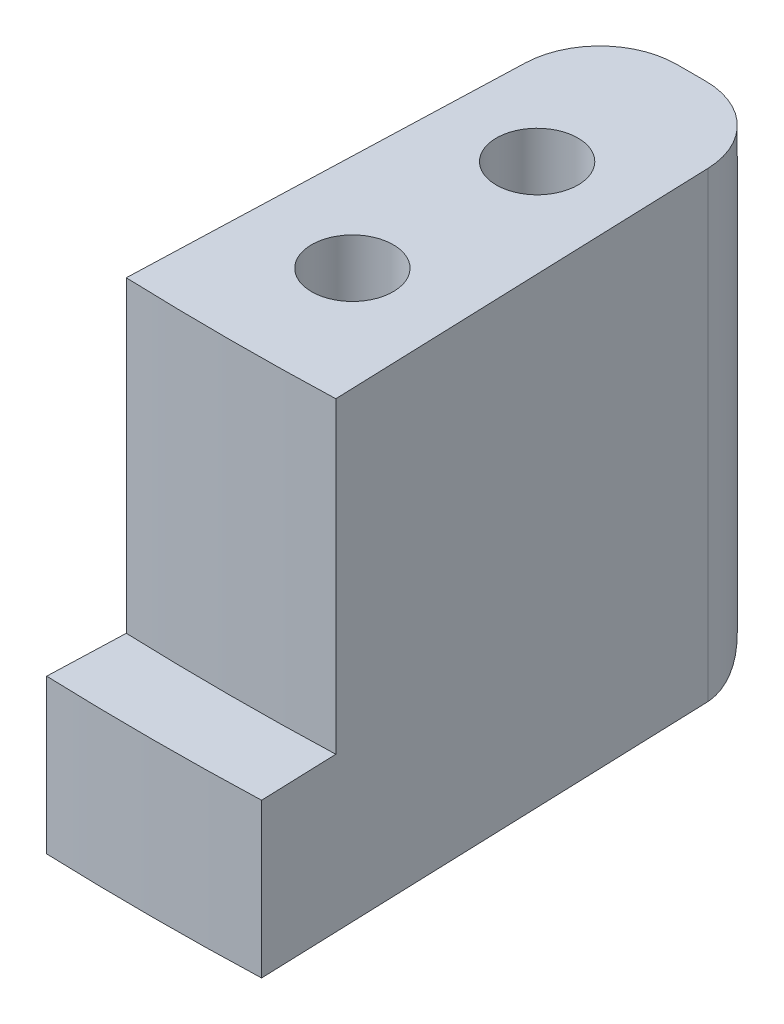
ISO-10303-21;
HEADER;
FILE_DESCRIPTION(('STEP AP214'),'2;1');
FILE_NAME('part.step','',(''),(''),'','','');
FILE_SCHEMA(('AUTOMOTIVE_DESIGN { 1 0 10303 214 1 1 1 1 }'));
ENDSEC;
DATA;
#1=APPLICATION_CONTEXT('core data for automotive mechanical design processes');
#2=APPLICATION_PROTOCOL_DEFINITION('international standard','automotive_design',2000,#1);
#3=PRODUCT_CONTEXT('',#1,'mechanical');
#4=PRODUCT('Part','Part','',(#3));
#5=PRODUCT_RELATED_PRODUCT_CATEGORY('part','',(#4));
#6=PRODUCT_DEFINITION_FORMATION('','',#4);
#7=PRODUCT_DEFINITION_CONTEXT('part definition',#1,'design');
#8=PRODUCT_DEFINITION('design','',#6,#7);
#9=PRODUCT_DEFINITION_SHAPE('','',#8);
#10=(LENGTH_UNIT() NAMED_UNIT(*) SI_UNIT(.MILLI.,.METRE.));
#11=(NAMED_UNIT(*) PLANE_ANGLE_UNIT() SI_UNIT($,.RADIAN.));
#12=(NAMED_UNIT(*) SI_UNIT($,.STERADIAN.) SOLID_ANGLE_UNIT());
#13=UNCERTAINTY_MEASURE_WITH_UNIT(LENGTH_MEASURE(1.E-05),#10,'distance_accuracy_value','');
#14=(GEOMETRIC_REPRESENTATION_CONTEXT(3) GLOBAL_UNCERTAINTY_ASSIGNED_CONTEXT((#13)) GLOBAL_UNIT_ASSIGNED_CONTEXT((#10,
#11,#12)) REPRESENTATION_CONTEXT('',''));
#15=CARTESIAN_POINT('',(0.,0.,0.));
#16=DIRECTION('',(0.,0.,1.));
#17=DIRECTION('',(1.,0.,0.));
#18=AXIS2_PLACEMENT_3D('',#15,#16,#17);
#19=CARTESIAN_POINT('',(0.,30.,175.));
#20=DIRECTION('',(0.,1.,0.));
#21=DIRECTION('',(0.,0.,1.));
#22=AXIS2_PLACEMENT_3D('',#19,#20,#21);
#23=CYLINDRICAL_SURFACE('',#22,2.65);
#24=CARTESIAN_POINT('',(0.,30.,175.));
#25=DIRECTION('',(0.,1.,0.));
#26=DIRECTION('',(0.,0.,1.));
#27=AXIS2_PLACEMENT_3D('',#24,#25,#26);
#28=CIRCLE('',#27,2.65);
#29=CARTESIAN_POINT('',(0.,30.,177.65));
#30=VERTEX_POINT('',#29);
#31=EDGE_CURVE('E283',#30,#30,#28,.T.);
#32=ORIENTED_EDGE('',*,*,#31,.T.);
#33=EDGE_LOOP('',(#32));
#34=FACE_BOUND('',#33,.T.);
#35=CARTESIAN_POINT('',(0.,5.,175.));
#36=DIRECTION('',(0.,-1.,0.));
#37=DIRECTION('',(0.,0.,-1.));
#38=AXIS2_PLACEMENT_3D('',#35,#36,#37);
#39=CIRCLE('',#38,2.65);
#40=CARTESIAN_POINT('',(0.,5.,172.35));
#41=VERTEX_POINT('',#40);
#42=EDGE_CURVE('E38',#41,#41,#39,.F.);
#43=ORIENTED_EDGE('',*,*,#42,.F.);
#44=EDGE_LOOP('',(#43));
#45=FACE_BOUND('',#44,.T.);
#46=ADVANCED_FACE('F34',(#34,#45),#23,.F.);
#47=CARTESIAN_POINT('',(0.,30.,187.));
#48=DIRECTION('',(0.,1.,0.));
#49=DIRECTION('',(0.,0.,1.));
#50=AXIS2_PLACEMENT_3D('',#47,#48,#49);
#51=CYLINDRICAL_SURFACE('',#50,2.65);
#52=CARTESIAN_POINT('',(0.,30.,187.));
#53=DIRECTION('',(0.,1.,0.));
#54=DIRECTION('',(0.,0.,1.));
#55=AXIS2_PLACEMENT_3D('',#52,#53,#54);
#56=CIRCLE('',#55,2.65);
#57=CARTESIAN_POINT('',(0.,30.,189.65));
#58=VERTEX_POINT('',#57);
#59=EDGE_CURVE('E280',#58,#58,#56,.T.);
#60=ORIENTED_EDGE('',*,*,#59,.T.);
#61=EDGE_LOOP('',(#60));
#62=FACE_BOUND('',#61,.T.);
#63=CARTESIAN_POINT('',(0.,5.,187.));
#64=DIRECTION('',(0.,-1.,0.));
#65=DIRECTION('',(0.,0.,-1.));
#66=AXIS2_PLACEMENT_3D('',#63,#64,#65);
#67=CIRCLE('',#66,2.65);
#68=CARTESIAN_POINT('',(0.,5.,184.35));
#69=VERTEX_POINT('',#68);
#70=EDGE_CURVE('E227',#69,#69,#67,.F.);
#71=ORIENTED_EDGE('',*,*,#70,.F.);
#72=EDGE_LOOP('',(#71));
#73=FACE_BOUND('',#72,.T.);
#74=ADVANCED_FACE('F353',(#62,#73),#51,.F.);
#75=CARTESIAN_POINT('',(0.,30.,0.));
#76=DIRECTION('',(0.999390827019096,0.,0.034899496702501));
#77=DIRECTION('',(0.034899496702501,0.,-0.999390827019096));
#78=AXIS2_PLACEMENT_3D('',#75,#76,#77);
#79=PLANE('',#78);
#80=DIRECTION('',(-0.034899496702501,0.,0.999390827019096));
#81=VECTOR('',#80,1.);
#82=CARTESIAN_POINT('',(0.,30.,0.));
#83=LINE('',#82,#81);
#84=CARTESIAN_POINT('',(-5.93043722719849,30.,169.825502516488));
#85=VERTEX_POINT('',#84);
#86=CARTESIAN_POINT('',(-6.80540185698768,30.,194.881211268724));
#87=VERTEX_POINT('',#86);
#88=EDGE_CURVE('E308',#85,#87,#83,.T.);
#89=ORIENTED_EDGE('',*,*,#88,.F.);
#90=DIRECTION('',(0.,-1.,0.));
#91=VECTOR('',#90,1.);
#92=CARTESIAN_POINT('',(-5.93043722719848,0.,169.825502516488));
#93=LINE('',#92,#91);
#94=CARTESIAN_POINT('',(-5.93043722719848,0.00304586490452183,169.825502516488));
#95=VERTEX_POINT('',#94);
#96=EDGE_CURVE('E328',#85,#95,#93,.T.);
#97=ORIENTED_EDGE('',*,*,#96,.T.);
#98=CARTESIAN_POINT('',(-5.93653081359711,5.,170.));
#99=DIRECTION('',(0.999390827019096,0.,0.034899496702501));
#100=DIRECTION('',(-0.034899496702501,0.,0.999390827019096));
#101=AXIS2_PLACEMENT_3D('',#98,#99,#100);
#102=ELLIPSE('',#101,5.00304772149411,5.);
#103=CARTESIAN_POINT('',(-5.93653081359711,0.,170.));
#104=VERTEX_POINT('',#103);
#105=EDGE_CURVE('E326',#95,#104,#102,.F.);
#106=ORIENTED_EDGE('',*,*,#105,.T.);
#107=DIRECTION('',(-0.034899496702501,0.,0.999390827019096));
#108=VECTOR('',#107,1.);
#109=CARTESIAN_POINT('',(0.,0.,0.));
#110=LINE('',#109,#108);
#111=CARTESIAN_POINT('',(-6.97989934050019,0.,199.878165403819));
#112=VERTEX_POINT('',#111);
#113=EDGE_CURVE('E307',#104,#112,#110,.T.);
#114=ORIENTED_EDGE('',*,*,#113,.T.);
#115=DIRECTION('',(0.,-1.,0.));
#116=VECTOR('',#115,1.);
#117=CARTESIAN_POINT('',(-6.97989934050019,10.,199.878165403819));
#118=LINE('',#117,#116);
#119=CARTESIAN_POINT('',(-6.97989934050019,10.,199.878165403819));
#120=VERTEX_POINT('',#119);
#121=EDGE_CURVE('E304',#120,#112,#118,.T.);
#122=ORIENTED_EDGE('',*,*,#121,.F.);
#123=DIRECTION('',(-0.034899496702501,0.,0.999390827019096));
#124=VECTOR('',#123,1.);
#125=CARTESIAN_POINT('',(0.,10.,0.));
#126=LINE('',#125,#124);
#127=CARTESIAN_POINT('',(-6.80540185698768,10.,194.881211268724));
#128=VERTEX_POINT('',#127);
#129=EDGE_CURVE('E287',#128,#120,#126,.T.);
#130=ORIENTED_EDGE('',*,*,#129,.F.);
#131=DIRECTION('',(0.,-1.,0.));
#132=VECTOR('',#131,1.);
#133=CARTESIAN_POINT('',(-6.80540185698768,30.,194.881211268724));
#134=LINE('',#133,#132);
#135=EDGE_CURVE('E324',#87,#128,#134,.T.);
#136=ORIENTED_EDGE('',*,*,#135,.F.);
#137=EDGE_LOOP('',(#89,#97,#106,#114,#122,#130,#136));
#138=FACE_BOUND('',#137,.T.);
#139=ADVANCED_FACE('F360',(#138),#79,.F.);
#140=CARTESIAN_POINT('',(0.,30.,0.));
#141=DIRECTION('',(0.,-1.,0.));
#142=DIRECTION('',(0.,0.,-1.));
#143=AXIS2_PLACEMENT_3D('',#140,#141,#142);
#144=CYLINDRICAL_SURFACE('',#143,195.);
#145=ORIENTED_EDGE('',*,*,#135,.T.);
#146=CARTESIAN_POINT('',(0.,10.,0.));
#147=DIRECTION('',(0.,1.,0.));
#148=DIRECTION('',(0.,0.,1.));
#149=AXIS2_PLACEMENT_3D('',#146,#147,#148);
#150=CIRCLE('',#149,195.);
#151=CARTESIAN_POINT('',(6.80540185698774,10.,194.881211268724));
#152=VERTEX_POINT('',#151);
#153=EDGE_CURVE('E296',#128,#152,#150,.T.);
#154=ORIENTED_EDGE('',*,*,#153,.T.);
#155=DIRECTION('',(0.,-1.,0.));
#156=VECTOR('',#155,1.);
#157=CARTESIAN_POINT('',(6.80540185698774,30.,194.881211268724));
#158=LINE('',#157,#156);
#159=CARTESIAN_POINT('',(6.80540185698774,30.,194.881211268724));
#160=VERTEX_POINT('',#159);
#161=EDGE_CURVE('E319',#160,#152,#158,.T.);
#162=ORIENTED_EDGE('',*,*,#161,.F.);
#163=CARTESIAN_POINT('',(0.,30.,0.));
#164=DIRECTION('',(0.,1.,0.));
#165=DIRECTION('',(0.,0.,1.));
#166=AXIS2_PLACEMENT_3D('',#163,#164,#165);
#167=CIRCLE('',#166,195.);
#168=EDGE_CURVE('E310',#87,#160,#167,.T.);
#169=ORIENTED_EDGE('',*,*,#168,.F.);
#170=EDGE_LOOP('',(#145,#154,#162,#169));
#171=FACE_BOUND('',#170,.T.);
#172=ADVANCED_FACE('F388',(#171),#144,.T.);
#173=CARTESIAN_POINT('',(0.,30.,0.));
#174=DIRECTION('',(0.999390827019096,0.,-0.0348994967025013));
#175=DIRECTION('',(-0.0348994967025013,0.,-0.999390827019096));
#176=AXIS2_PLACEMENT_3D('',#173,#174,#175);
#177=PLANE('',#176);
#178=CARTESIAN_POINT('',(5.93653081359717,5.,170.));
#179=DIRECTION('',(0.999390827019096,0.,-0.0348994967025013));
#180=DIRECTION('',(-0.0348994967025013,0.,-0.999390827019096));
#181=AXIS2_PLACEMENT_3D('',#178,#179,#180);
#182=ELLIPSE('',#181,5.00304772149411,5.);
#183=CARTESIAN_POINT('',(5.93653081359717,0.,170.));
#184=VERTEX_POINT('',#183);
#185=CARTESIAN_POINT('',(5.93043722719854,0.00304586490452313,169.825502516488));
#186=VERTEX_POINT('',#185);
#187=EDGE_CURVE('E341',#184,#186,#182,.T.);
#188=ORIENTED_EDGE('',*,*,#187,.T.);
#189=DIRECTION('',(0.,-1.,0.));
#190=VECTOR('',#189,1.);
#191=CARTESIAN_POINT('',(5.93043722719854,30.,169.825502516488));
#192=LINE('',#191,#190);
#193=CARTESIAN_POINT('',(5.93043722719854,30.,169.825502516488));
#194=VERTEX_POINT('',#193);
#195=EDGE_CURVE('E43',#186,#194,#192,.F.);
#196=ORIENTED_EDGE('',*,*,#195,.T.);
#197=DIRECTION('',(0.0348994967025013,0.,0.999390827019096));
#198=VECTOR('',#197,1.);
#199=CARTESIAN_POINT('',(0.,30.,0.));
#200=LINE('',#199,#198);
#201=EDGE_CURVE('E314',#194,#160,#200,.T.);
#202=ORIENTED_EDGE('',*,*,#201,.T.);
#203=ORIENTED_EDGE('',*,*,#161,.T.);
#204=DIRECTION('',(0.0348994967025013,0.,0.999390827019096));
#205=VECTOR('',#204,1.);
#206=CARTESIAN_POINT('',(0.,10.,0.));
#207=LINE('',#206,#205);
#208=CARTESIAN_POINT('',(6.97989934050026,10.,199.878165403819));
#209=VERTEX_POINT('',#208);
#210=EDGE_CURVE('E293',#152,#209,#207,.T.);
#211=ORIENTED_EDGE('',*,*,#210,.T.);
#212=DIRECTION('',(0.,-1.,0.));
#213=VECTOR('',#212,1.);
#214=CARTESIAN_POINT('',(6.97989934050026,10.,199.878165403819));
#215=LINE('',#214,#213);
#216=CARTESIAN_POINT('',(6.97989934050026,0.,199.878165403819));
#217=VERTEX_POINT('',#216);
#218=EDGE_CURVE('E298',#209,#217,#215,.T.);
#219=ORIENTED_EDGE('',*,*,#218,.T.);
#220=DIRECTION('',(0.0348994967025013,0.,0.999390827019096));
#221=VECTOR('',#220,1.);
#222=CARTESIAN_POINT('',(0.,0.,0.));
#223=LINE('',#222,#221);
#224=EDGE_CURVE('E311',#184,#217,#223,.T.);
#225=ORIENTED_EDGE('',*,*,#224,.F.);
#226=EDGE_LOOP('',(#188,#196,#202,#203,#211,#219,#225));
#227=FACE_BOUND('',#226,.T.);
#228=ADVANCED_FACE('F384',(#227),#177,.T.);
#229=CARTESIAN_POINT('',(0.,30.,165.));
#230=DIRECTION('',(0.,0.,-1.));
#231=DIRECTION('',(-1.,0.,0.));
#232=AXIS2_PLACEMENT_3D('',#229,#230,#231);
#233=PLANE('',#232);
#234=DIRECTION('',(1.,0.,0.));
#235=VECTOR('',#234,1.);
#236=CARTESIAN_POINT('',(-5.76192696613837,5.,165.));
#237=LINE('',#236,#235);
#238=CARTESIAN_POINT('',(0.933483092103059,5.,165.));
#239=VERTEX_POINT('',#238);
#240=CARTESIAN_POINT('',(-0.933483092103004,5.,165.));
#241=VERTEX_POINT('',#240);
#242=EDGE_CURVE('E331',#239,#241,#237,.F.);
#243=ORIENTED_EDGE('',*,*,#242,.T.);
#244=DIRECTION('',(0.,-1.,0.));
#245=VECTOR('',#244,1.);
#246=CARTESIAN_POINT('',(-0.933483092103004,30.,165.));
#247=LINE('',#246,#245);
#248=CARTESIAN_POINT('',(-0.933483092103004,30.,165.));
#249=VERTEX_POINT('',#248);
#250=EDGE_CURVE('E335',#241,#249,#247,.F.);
#251=ORIENTED_EDGE('',*,*,#250,.T.);
#252=DIRECTION('',(1.,0.,0.));
#253=VECTOR('',#252,1.);
#254=CARTESIAN_POINT('',(0.,30.,165.));
#255=LINE('',#254,#253);
#256=CARTESIAN_POINT('',(0.933483092103059,30.,165.));
#257=VERTEX_POINT('',#256);
#258=EDGE_CURVE('E316',#249,#257,#255,.T.);
#259=ORIENTED_EDGE('',*,*,#258,.T.);
#260=DIRECTION('',(0.,-1.,0.));
#261=VECTOR('',#260,1.);
#262=CARTESIAN_POINT('',(0.933483092103059,30.,165.));
#263=LINE('',#262,#261);
#264=EDGE_CURVE('E333',#257,#239,#263,.T.);
#265=ORIENTED_EDGE('',*,*,#264,.T.);
#266=EDGE_LOOP('',(#243,#251,#259,#265));
#267=FACE_BOUND('',#266,.T.);
#268=ADVANCED_FACE('F377',(#267),#233,.T.);
#269=CARTESIAN_POINT('',(0.,30.,0.));
#270=DIRECTION('',(0.,1.,0.));
#271=DIRECTION('',(0.,0.,1.));
#272=AXIS2_PLACEMENT_3D('',#269,#270,#271);
#273=PLANE('',#272);
#274=ORIENTED_EDGE('',*,*,#59,.F.);
#275=EDGE_LOOP('',(#274));
#276=FACE_BOUND('',#275,.T.);
#277=ORIENTED_EDGE('',*,*,#31,.F.);
#278=EDGE_LOOP('',(#277));
#279=FACE_BOUND('',#278,.T.);
#280=ORIENTED_EDGE('',*,*,#258,.F.);
#281=CARTESIAN_POINT('',(-0.933483092103004,30.,170.));
#282=DIRECTION('',(0.,1.,0.));
#283=DIRECTION('',(0.,0.,1.));
#284=AXIS2_PLACEMENT_3D('',#281,#282,#283);
#285=CIRCLE('',#284,5.);
#286=EDGE_CURVE('E339',#249,#85,#285,.T.);
#287=ORIENTED_EDGE('',*,*,#286,.T.);
#288=ORIENTED_EDGE('',*,*,#88,.T.);
#289=ORIENTED_EDGE('',*,*,#168,.T.);
#290=ORIENTED_EDGE('',*,*,#201,.F.);
#291=CARTESIAN_POINT('',(0.933483092103059,30.,170.));
#292=DIRECTION('',(0.,1.,0.));
#293=DIRECTION('',(0.,0.,1.));
#294=AXIS2_PLACEMENT_3D('',#291,#292,#293);
#295=CIRCLE('',#294,5.);
#296=EDGE_CURVE('E337',#194,#257,#295,.T.);
#297=ORIENTED_EDGE('',*,*,#296,.T.);
#298=EDGE_LOOP('',(#280,#287,#288,#289,#290,#297));
#299=FACE_BOUND('',#298,.T.);
#300=ADVANCED_FACE('F374',(#276,#279,#299),#273,.T.);
#301=CARTESIAN_POINT('',(0.,0.,0.));
#302=DIRECTION('',(0.,1.,0.));
#303=DIRECTION('',(0.,0.,1.));
#304=AXIS2_PLACEMENT_3D('',#301,#302,#303);
#305=PLANE('',#304);
#306=DIRECTION('',(0.5,0.,-0.866025403784439));
#307=VECTOR('',#306,1.);
#308=CARTESIAN_POINT('',(-4.67653718043598,0.,175.));
#309=LINE('',#308,#307);
#310=CARTESIAN_POINT('',(-4.67653718043598,0.,175.));
#311=VERTEX_POINT('',#310);
#312=CARTESIAN_POINT('',(-2.33826859021798,0.,170.95));
#313=VERTEX_POINT('',#312);
#314=EDGE_CURVE('E214',#311,#313,#309,.T.);
#315=ORIENTED_EDGE('',*,*,#314,.F.);
#316=DIRECTION('',(-0.5,0.,-0.866025403784439));
#317=VECTOR('',#316,1.);
#318=CARTESIAN_POINT('',(-2.33826859021799,0.,179.05));
#319=LINE('',#318,#317);
#320=CARTESIAN_POINT('',(-2.33826859021799,0.,179.05));
#321=VERTEX_POINT('',#320);
#322=EDGE_CURVE('E51',#321,#311,#319,.T.);
#323=ORIENTED_EDGE('',*,*,#322,.F.);
#324=DIRECTION('',(-1.,0.,0.));
#325=VECTOR('',#324,1.);
#326=CARTESIAN_POINT('',(2.33826859021798,0.,179.05));
#327=LINE('',#326,#325);
#328=CARTESIAN_POINT('',(2.33826859021798,0.,179.05));
#329=VERTEX_POINT('',#328);
#330=EDGE_CURVE('E200',#329,#321,#327,.T.);
#331=ORIENTED_EDGE('',*,*,#330,.F.);
#332=DIRECTION('',(-0.500000000000001,0.,0.866025403784438));
#333=VECTOR('',#332,1.);
#334=CARTESIAN_POINT('',(4.67653718043597,0.,175.));
#335=LINE('',#334,#333);
#336=CARTESIAN_POINT('',(4.67653718043597,0.,175.));
#337=VERTEX_POINT('',#336);
#338=EDGE_CURVE('E203',#337,#329,#335,.T.);
#339=ORIENTED_EDGE('',*,*,#338,.F.);
#340=DIRECTION('',(0.499999999999999,0.,0.866025403784439));
#341=VECTOR('',#340,1.);
#342=CARTESIAN_POINT('',(2.33826859021798,0.,170.95));
#343=LINE('',#342,#341);
#344=CARTESIAN_POINT('',(2.33826859021798,0.,170.95));
#345=VERTEX_POINT('',#344);
#346=EDGE_CURVE('E220',#345,#337,#343,.T.);
#347=ORIENTED_EDGE('',*,*,#346,.F.);
#348=DIRECTION('',(1.,0.,0.));
#349=VECTOR('',#348,1.);
#350=CARTESIAN_POINT('',(-2.33826859021798,0.,170.95));
#351=LINE('',#350,#349);
#352=EDGE_CURVE('E217',#313,#345,#351,.T.);
#353=ORIENTED_EDGE('',*,*,#352,.F.);
#354=EDGE_LOOP('',(#315,#323,#331,#339,#347,#353));
#355=FACE_BOUND('',#354,.T.);
#356=DIRECTION('',(0.5,0.,-0.866025403784438));
#357=VECTOR('',#356,1.);
#358=CARTESIAN_POINT('',(-4.67653718043598,0.,187.));
#359=LINE('',#358,#357);
#360=CARTESIAN_POINT('',(-4.67653718043597,0.,187.));
#361=VERTEX_POINT('',#360);
#362=CARTESIAN_POINT('',(-2.33826859021798,0.,182.95));
#363=VERTEX_POINT('',#362);
#364=EDGE_CURVE('E256',#361,#363,#359,.T.);
#365=ORIENTED_EDGE('',*,*,#364,.F.);
#366=DIRECTION('',(-0.5,0.,-0.866025403784439));
#367=VECTOR('',#366,1.);
#368=CARTESIAN_POINT('',(-2.33826859021798,0.,191.05));
#369=LINE('',#368,#367);
#370=CARTESIAN_POINT('',(-2.33826859021798,0.,191.05));
#371=VERTEX_POINT('',#370);
#372=EDGE_CURVE('E59',#371,#361,#369,.T.);
#373=ORIENTED_EDGE('',*,*,#372,.F.);
#374=DIRECTION('',(-1.,0.,0.));
#375=VECTOR('',#374,1.);
#376=CARTESIAN_POINT('',(2.33826859021795,0.,191.05));
#377=LINE('',#376,#375);
#378=CARTESIAN_POINT('',(2.33826859021795,0.,191.05));
#379=VERTEX_POINT('',#378);
#380=EDGE_CURVE('E239',#379,#371,#377,.T.);
#381=ORIENTED_EDGE('',*,*,#380,.F.);
#382=DIRECTION('',(-0.499999999999999,0.,0.866025403784439));
#383=VECTOR('',#382,1.);
#384=CARTESIAN_POINT('',(4.67653718043596,0.,187.));
#385=LINE('',#384,#383);
#386=CARTESIAN_POINT('',(4.67653718043596,0.,187.));
#387=VERTEX_POINT('',#386);
#388=EDGE_CURVE('E265',#387,#379,#385,.T.);
#389=ORIENTED_EDGE('',*,*,#388,.F.);
#390=DIRECTION('',(0.5,0.,0.866025403784438));
#391=VECTOR('',#390,1.);
#392=CARTESIAN_POINT('',(2.33826859021798,0.,182.95));
#393=LINE('',#392,#391);
#394=CARTESIAN_POINT('',(2.33826859021798,0.,182.95));
#395=VERTEX_POINT('',#394);
#396=EDGE_CURVE('E262',#395,#387,#393,.T.);
#397=ORIENTED_EDGE('',*,*,#396,.F.);
#398=DIRECTION('',(1.,0.,0.));
#399=VECTOR('',#398,1.);
#400=CARTESIAN_POINT('',(-2.33826859021798,0.,182.95));
#401=LINE('',#400,#399);
#402=EDGE_CURVE('E259',#363,#395,#401,.T.);
#403=ORIENTED_EDGE('',*,*,#402,.F.);
#404=EDGE_LOOP('',(#365,#373,#381,#389,#397,#403));
#405=FACE_BOUND('',#404,.T.);
#406=ORIENTED_EDGE('',*,*,#113,.F.);
#407=DIRECTION('',(1.,0.,0.));
#408=VECTOR('',#407,1.);
#409=CARTESIAN_POINT('',(5.76192696613841,0.,170.));
#410=LINE('',#409,#408);
#411=EDGE_CURVE('E11',#104,#184,#410,.T.);
#412=ORIENTED_EDGE('',*,*,#411,.T.);
#413=ORIENTED_EDGE('',*,*,#224,.T.);
#414=CARTESIAN_POINT('',(0.,0.,0.));
#415=DIRECTION('',(0.,1.,0.));
#416=DIRECTION('',(0.,0.,1.));
#417=AXIS2_PLACEMENT_3D('',#414,#415,#416);
#418=CIRCLE('',#417,200.);
#419=EDGE_CURVE('E291',#112,#217,#418,.T.);
#420=ORIENTED_EDGE('',*,*,#419,.F.);
#421=EDGE_LOOP('',(#406,#412,#413,#420));
#422=FACE_BOUND('',#421,.T.);
#423=ADVANCED_FACE('F372',(#355,#405,#422),#305,.F.);
#424=CARTESIAN_POINT('',(0.,10.,0.));
#425=DIRECTION('',(0.,-1.,0.));
#426=DIRECTION('',(0.,0.,-1.));
#427=AXIS2_PLACEMENT_3D('',#424,#425,#426);
#428=CYLINDRICAL_SURFACE('',#427,200.);
#429=ORIENTED_EDGE('',*,*,#419,.T.);
#430=ORIENTED_EDGE('',*,*,#218,.F.);
#431=CARTESIAN_POINT('',(0.,10.,0.));
#432=DIRECTION('',(0.,1.,0.));
#433=DIRECTION('',(0.,0.,1.));
#434=AXIS2_PLACEMENT_3D('',#431,#432,#433);
#435=CIRCLE('',#434,200.);
#436=EDGE_CURVE('E290',#120,#209,#435,.T.);
#437=ORIENTED_EDGE('',*,*,#436,.F.);
#438=ORIENTED_EDGE('',*,*,#121,.T.);
#439=EDGE_LOOP('',(#429,#430,#437,#438));
#440=FACE_BOUND('',#439,.T.);
#441=ADVANCED_FACE('F368',(#440),#428,.T.);
#442=CARTESIAN_POINT('',(0.,10.,0.));
#443=DIRECTION('',(0.,1.,0.));
#444=DIRECTION('',(0.,0.,1.));
#445=AXIS2_PLACEMENT_3D('',#442,#443,#444);
#446=PLANE('',#445);
#447=ORIENTED_EDGE('',*,*,#129,.T.);
#448=ORIENTED_EDGE('',*,*,#436,.T.);
#449=ORIENTED_EDGE('',*,*,#210,.F.);
#450=ORIENTED_EDGE('',*,*,#153,.F.);
#451=EDGE_LOOP('',(#447,#448,#449,#450));
#452=FACE_BOUND('',#451,.T.);
#453=ADVANCED_FACE('F365',(#452),#446,.T.);
#454=CARTESIAN_POINT('',(0.933483092103059,30.,170.));
#455=DIRECTION('',(0.,-1.,0.));
#456=DIRECTION('',(0.,0.,-1.));
#457=AXIS2_PLACEMENT_3D('',#454,#455,#456);
#458=CYLINDRICAL_SURFACE('',#457,5.);
#459=ORIENTED_EDGE('',*,*,#296,.F.);
#460=ORIENTED_EDGE('',*,*,#195,.F.);
#461=CARTESIAN_POINT('',(0.933483092103059,5.,170.));
#462=DIRECTION('',(-0.707106781186547,-0.707106781186547,0.));
#463=DIRECTION('',(-0.707106781186547,0.707106781186547,0.));
#464=AXIS2_PLACEMENT_3D('',#461,#462,#463);
#465=ELLIPSE('',#464,7.07106781186547,5.);
#466=EDGE_CURVE('E301',#239,#186,#465,.T.);
#467=ORIENTED_EDGE('',*,*,#466,.F.);
#468=ORIENTED_EDGE('',*,*,#264,.F.);
#469=EDGE_LOOP('',(#459,#460,#467,#468));
#470=FACE_BOUND('',#469,.T.);
#471=ADVANCED_FACE('F36',(#470),#458,.T.);
#472=CARTESIAN_POINT('',(0.,5.,170.));
#473=DIRECTION('',(-1.,0.,0.));
#474=DIRECTION('',(0.,0.,1.));
#475=AXIS2_PLACEMENT_3D('',#472,#473,#474);
#476=CYLINDRICAL_SURFACE('',#475,5.);
#477=ORIENTED_EDGE('',*,*,#411,.F.);
#478=ORIENTED_EDGE('',*,*,#105,.F.);
#479=CARTESIAN_POINT('',(-0.933483092103004,5.,170.));
#480=DIRECTION('',(-0.707106781186547,0.707106781186547,0.));
#481=DIRECTION('',(-0.707106781186547,-0.707106781186547,0.));
#482=AXIS2_PLACEMENT_3D('',#479,#480,#481);
#483=ELLIPSE('',#482,7.07106781186547,5.);
#484=EDGE_CURVE('E286',#241,#95,#483,.T.);
#485=ORIENTED_EDGE('',*,*,#484,.F.);
#486=ORIENTED_EDGE('',*,*,#242,.F.);
#487=ORIENTED_EDGE('',*,*,#466,.T.);
#488=ORIENTED_EDGE('',*,*,#187,.F.);
#489=EDGE_LOOP('',(#477,#478,#485,#486,#487,#488));
#490=FACE_BOUND('',#489,.T.);
#491=ADVANCED_FACE('F399',(#490),#476,.T.);
#492=CARTESIAN_POINT('',(-0.933483092103004,30.,170.));
#493=DIRECTION('',(0.,1.,0.));
#494=DIRECTION('',(0.,0.,1.));
#495=AXIS2_PLACEMENT_3D('',#492,#493,#494);
#496=CYLINDRICAL_SURFACE('',#495,5.);
#497=ORIENTED_EDGE('',*,*,#286,.F.);
#498=ORIENTED_EDGE('',*,*,#250,.F.);
#499=ORIENTED_EDGE('',*,*,#484,.T.);
#500=ORIENTED_EDGE('',*,*,#96,.F.);
#501=EDGE_LOOP('',(#497,#498,#499,#500));
#502=FACE_BOUND('',#501,.T.);
#503=ADVANCED_FACE('F396',(#502),#496,.T.);
#504=CARTESIAN_POINT('',(0.,5.,0.));
#505=DIRECTION('',(0.,-1.,0.));
#506=DIRECTION('',(0.,0.,-1.));
#507=AXIS2_PLACEMENT_3D('',#504,#505,#506);
#508=PLANE('',#507);
#509=DIRECTION('',(-0.5,0.,-0.866025403784439));
#510=VECTOR('',#509,1.);
#511=CARTESIAN_POINT('',(-2.33826859021798,5.,191.05));
#512=LINE('',#511,#510);
#513=CARTESIAN_POINT('',(-2.33826859021798,5.,191.05));
#514=VERTEX_POINT('',#513);
#515=CARTESIAN_POINT('',(-4.67653718043598,5.,187.));
#516=VERTEX_POINT('',#515);
#517=EDGE_CURVE('E235',#514,#516,#512,.T.);
#518=ORIENTED_EDGE('',*,*,#517,.T.);
#519=DIRECTION('',(0.5,0.,-0.866025403784438));
#520=VECTOR('',#519,1.);
#521=CARTESIAN_POINT('',(-4.67653718043598,5.,187.));
#522=LINE('',#521,#520);
#523=CARTESIAN_POINT('',(-2.33826859021798,5.,182.95));
#524=VERTEX_POINT('',#523);
#525=EDGE_CURVE('E238',#516,#524,#522,.T.);
#526=ORIENTED_EDGE('',*,*,#525,.T.);
#527=DIRECTION('',(1.,0.,0.));
#528=VECTOR('',#527,1.);
#529=CARTESIAN_POINT('',(-2.33826859021798,5.,182.95));
#530=LINE('',#529,#528);
#531=CARTESIAN_POINT('',(2.33826859021798,5.,182.95));
#532=VERTEX_POINT('',#531);
#533=EDGE_CURVE('E242',#524,#532,#530,.T.);
#534=ORIENTED_EDGE('',*,*,#533,.T.);
#535=DIRECTION('',(0.5,0.,0.866025403784438));
#536=VECTOR('',#535,1.);
#537=CARTESIAN_POINT('',(2.33826859021798,5.,182.95));
#538=LINE('',#537,#536);
#539=CARTESIAN_POINT('',(4.67653718043596,5.,187.));
#540=VERTEX_POINT('',#539);
#541=EDGE_CURVE('E245',#532,#540,#538,.T.);
#542=ORIENTED_EDGE('',*,*,#541,.T.);
#543=DIRECTION('',(-0.499999999999999,0.,0.866025403784439));
#544=VECTOR('',#543,1.);
#545=CARTESIAN_POINT('',(4.67653718043596,5.,187.));
#546=LINE('',#545,#544);
#547=CARTESIAN_POINT('',(2.33826859021795,5.,191.05));
#548=VERTEX_POINT('',#547);
#549=EDGE_CURVE('E248',#540,#548,#546,.T.);
#550=ORIENTED_EDGE('',*,*,#549,.T.);
#551=DIRECTION('',(-1.,0.,0.));
#552=VECTOR('',#551,1.);
#553=CARTESIAN_POINT('',(2.33826859021795,5.,191.05));
#554=LINE('',#553,#552);
#555=EDGE_CURVE('E251',#548,#514,#554,.T.);
#556=ORIENTED_EDGE('',*,*,#555,.T.);
#557=EDGE_LOOP('',(#518,#526,#534,#542,#550,#556));
#558=FACE_BOUND('',#557,.T.);
#559=ORIENTED_EDGE('',*,*,#70,.T.);
#560=EDGE_LOOP('',(#559));
#561=FACE_BOUND('',#560,.T.);
#562=ADVANCED_FACE('F398',(#558,#561),#508,.T.);
#563=CARTESIAN_POINT('',(-2.33826859021798,5.,191.05));
#564=DIRECTION('',(-0.866025403784439,0.,0.5));
#565=DIRECTION('',(0.5,0.,0.866025403784439));
#566=AXIS2_PLACEMENT_3D('',#563,#564,#565);
#567=PLANE('',#566);
#568=ORIENTED_EDGE('',*,*,#372,.T.);
#569=DIRECTION('',(0.,-1.,0.));
#570=VECTOR('',#569,1.);
#571=CARTESIAN_POINT('',(-4.67653718043598,5.,187.));
#572=LINE('',#571,#570);
#573=EDGE_CURVE('E254',#516,#361,#572,.T.);
#574=ORIENTED_EDGE('',*,*,#573,.F.);
#575=ORIENTED_EDGE('',*,*,#517,.F.);
#576=DIRECTION('',(0.,-1.,0.));
#577=VECTOR('',#576,1.);
#578=CARTESIAN_POINT('',(-2.33826859021798,5.,191.05));
#579=LINE('',#578,#577);
#580=EDGE_CURVE('E215',#514,#371,#579,.T.);
#581=ORIENTED_EDGE('',*,*,#580,.T.);
#582=EDGE_LOOP('',(#568,#574,#575,#581));
#583=FACE_BOUND('',#582,.T.);
#584=ADVANCED_FACE('F521',(#583),#567,.F.);
#585=CARTESIAN_POINT('',(2.33826859021795,5.,191.05));
#586=DIRECTION('',(0.,0.,1.));
#587=DIRECTION('',(1.,0.,0.));
#588=AXIS2_PLACEMENT_3D('',#585,#586,#587);
#589=PLANE('',#588);
#590=ORIENTED_EDGE('',*,*,#380,.T.);
#591=ORIENTED_EDGE('',*,*,#580,.F.);
#592=ORIENTED_EDGE('',*,*,#555,.F.);
#593=DIRECTION('',(0.,-1.,0.));
#594=VECTOR('',#593,1.);
#595=CARTESIAN_POINT('',(2.33826859021795,5.,191.05));
#596=LINE('',#595,#594);
#597=EDGE_CURVE('E271',#548,#379,#596,.T.);
#598=ORIENTED_EDGE('',*,*,#597,.T.);
#599=EDGE_LOOP('',(#590,#591,#592,#598));
#600=FACE_BOUND('',#599,.T.);
#601=ADVANCED_FACE('F528',(#600),#589,.F.);
#602=CARTESIAN_POINT('',(4.67653718043596,5.,187.));
#603=DIRECTION('',(0.866025403784439,0.,0.499999999999999));
#604=DIRECTION('',(0.499999999999999,0.,-0.866025403784439));
#605=AXIS2_PLACEMENT_3D('',#602,#603,#604);
#606=PLANE('',#605);
#607=ORIENTED_EDGE('',*,*,#388,.T.);
#608=ORIENTED_EDGE('',*,*,#597,.F.);
#609=ORIENTED_EDGE('',*,*,#549,.F.);
#610=DIRECTION('',(0.,-1.,0.));
#611=VECTOR('',#610,1.);
#612=CARTESIAN_POINT('',(4.67653718043596,5.,187.));
#613=LINE('',#612,#611);
#614=EDGE_CURVE('E273',#540,#387,#613,.T.);
#615=ORIENTED_EDGE('',*,*,#614,.T.);
#616=EDGE_LOOP('',(#607,#608,#609,#615));
#617=FACE_BOUND('',#616,.T.);
#618=ADVANCED_FACE('F534',(#617),#606,.F.);
#619=CARTESIAN_POINT('',(2.33826859021798,5.,182.95));
#620=DIRECTION('',(0.866025403784438,0.,-0.5));
#621=DIRECTION('',(-0.5,0.,-0.866025403784438));
#622=AXIS2_PLACEMENT_3D('',#619,#620,#621);
#623=PLANE('',#622);
#624=ORIENTED_EDGE('',*,*,#396,.T.);
#625=ORIENTED_EDGE('',*,*,#614,.F.);
#626=ORIENTED_EDGE('',*,*,#541,.F.);
#627=DIRECTION('',(0.,-1.,0.));
#628=VECTOR('',#627,1.);
#629=CARTESIAN_POINT('',(2.33826859021798,5.,182.95));
#630=LINE('',#629,#628);
#631=EDGE_CURVE('E275',#532,#395,#630,.T.);
#632=ORIENTED_EDGE('',*,*,#631,.T.);
#633=EDGE_LOOP('',(#624,#625,#626,#632));
#634=FACE_BOUND('',#633,.T.);
#635=ADVANCED_FACE('F542',(#634),#623,.F.);
#636=CARTESIAN_POINT('',(-2.33826859021798,5.,182.95));
#637=DIRECTION('',(0.,0.,-1.));
#638=DIRECTION('',(-1.,0.,0.));
#639=AXIS2_PLACEMENT_3D('',#636,#637,#638);
#640=PLANE('',#639);
#641=ORIENTED_EDGE('',*,*,#402,.T.);
#642=ORIENTED_EDGE('',*,*,#631,.F.);
#643=ORIENTED_EDGE('',*,*,#533,.F.);
#644=DIRECTION('',(0.,-1.,0.));
#645=VECTOR('',#644,1.);
#646=CARTESIAN_POINT('',(-2.33826859021798,5.,182.95));
#647=LINE('',#646,#645);
#648=EDGE_CURVE('E277',#524,#363,#647,.T.);
#649=ORIENTED_EDGE('',*,*,#648,.T.);
#650=EDGE_LOOP('',(#641,#642,#643,#649));
#651=FACE_BOUND('',#650,.T.);
#652=ADVANCED_FACE('F550',(#651),#640,.F.);
#653=CARTESIAN_POINT('',(-4.67653718043598,5.,187.));
#654=DIRECTION('',(-0.866025403784438,0.,-0.5));
#655=DIRECTION('',(-0.5,0.,0.866025403784439));
#656=AXIS2_PLACEMENT_3D('',#653,#654,#655);
#657=PLANE('',#656);
#658=ORIENTED_EDGE('',*,*,#364,.T.);
#659=ORIENTED_EDGE('',*,*,#648,.F.);
#660=ORIENTED_EDGE('',*,*,#525,.F.);
#661=ORIENTED_EDGE('',*,*,#573,.T.);
#662=EDGE_LOOP('',(#658,#659,#660,#661));
#663=FACE_BOUND('',#662,.T.);
#664=ADVANCED_FACE('F558',(#663),#657,.F.);
#665=CARTESIAN_POINT('',(0.,5.,0.));
#666=DIRECTION('',(0.,-1.,0.));
#667=DIRECTION('',(0.,0.,-1.));
#668=AXIS2_PLACEMENT_3D('',#665,#666,#667);
#669=PLANE('',#668);
#670=DIRECTION('',(-0.5,0.,-0.866025403784439));
#671=VECTOR('',#670,1.);
#672=CARTESIAN_POINT('',(-2.33826859021799,5.,179.05));
#673=LINE('',#672,#671);
#674=CARTESIAN_POINT('',(-2.33826859021799,5.,179.05));
#675=VERTEX_POINT('',#674);
#676=CARTESIAN_POINT('',(-4.67653718043598,5.,175.));
#677=VERTEX_POINT('',#676);
#678=EDGE_CURVE('E180',#675,#677,#673,.T.);
#679=ORIENTED_EDGE('',*,*,#678,.T.);
#680=DIRECTION('',(0.5,0.,-0.866025403784439));
#681=VECTOR('',#680,1.);
#682=CARTESIAN_POINT('',(-4.67653718043598,5.,175.));
#683=LINE('',#682,#681);
#684=CARTESIAN_POINT('',(-2.33826859021798,5.,170.95));
#685=VERTEX_POINT('',#684);
#686=EDGE_CURVE('E189',#677,#685,#683,.T.);
#687=ORIENTED_EDGE('',*,*,#686,.T.);
#688=DIRECTION('',(1.,0.,0.));
#689=VECTOR('',#688,1.);
#690=CARTESIAN_POINT('',(-2.33826859021798,5.,170.95));
#691=LINE('',#690,#689);
#692=CARTESIAN_POINT('',(2.33826859021798,5.,170.95));
#693=VERTEX_POINT('',#692);
#694=EDGE_CURVE('E194',#685,#693,#691,.T.);
#695=ORIENTED_EDGE('',*,*,#694,.T.);
#696=DIRECTION('',(0.499999999999999,0.,0.866025403784439));
#697=VECTOR('',#696,1.);
#698=CARTESIAN_POINT('',(2.33826859021798,5.,170.95));
#699=LINE('',#698,#697);
#700=CARTESIAN_POINT('',(4.67653718043597,5.,175.));
#701=VERTEX_POINT('',#700);
#702=EDGE_CURVE('E207',#693,#701,#699,.T.);
#703=ORIENTED_EDGE('',*,*,#702,.T.);
#704=DIRECTION('',(-0.500000000000001,0.,0.866025403784438));
#705=VECTOR('',#704,1.);
#706=CARTESIAN_POINT('',(4.67653718043597,5.,175.));
#707=LINE('',#706,#705);
#708=CARTESIAN_POINT('',(2.33826859021798,5.,179.05));
#709=VERTEX_POINT('',#708);
#710=EDGE_CURVE('E210',#701,#709,#707,.T.);
#711=ORIENTED_EDGE('',*,*,#710,.T.);
#712=DIRECTION('',(-1.,0.,0.));
#713=VECTOR('',#712,1.);
#714=CARTESIAN_POINT('',(2.33826859021798,5.,179.05));
#715=LINE('',#714,#713);
#716=EDGE_CURVE('E186',#709,#675,#715,.T.);
#717=ORIENTED_EDGE('',*,*,#716,.T.);
#718=EDGE_LOOP('',(#679,#687,#695,#703,#711,#717));
#719=FACE_BOUND('',#718,.T.);
#720=ORIENTED_EDGE('',*,*,#42,.T.);
#721=EDGE_LOOP('',(#720));
#722=FACE_BOUND('',#721,.T.);
#723=ADVANCED_FACE('F196',(#719,#722),#669,.T.);
#724=CARTESIAN_POINT('',(-2.33826859021799,5.,179.05));
#725=DIRECTION('',(-0.866025403784439,0.,0.5));
#726=DIRECTION('',(0.5,0.,0.866025403784439));
#727=AXIS2_PLACEMENT_3D('',#724,#725,#726);
#728=PLANE('',#727);
#729=ORIENTED_EDGE('',*,*,#322,.T.);
#730=DIRECTION('',(0.,-1.,0.));
#731=VECTOR('',#730,1.);
#732=CARTESIAN_POINT('',(-4.67653718043598,5.,175.));
#733=LINE('',#732,#731);
#734=EDGE_CURVE('E176',#677,#311,#733,.T.);
#735=ORIENTED_EDGE('',*,*,#734,.F.);
#736=ORIENTED_EDGE('',*,*,#678,.F.);
#737=DIRECTION('',(0.,-1.,0.));
#738=VECTOR('',#737,1.);
#739=CARTESIAN_POINT('',(-2.33826859021799,5.,179.05));
#740=LINE('',#739,#738);
#741=EDGE_CURVE('E225',#675,#321,#740,.T.);
#742=ORIENTED_EDGE('',*,*,#741,.T.);
#743=EDGE_LOOP('',(#729,#735,#736,#742));
#744=FACE_BOUND('',#743,.T.);
#745=ADVANCED_FACE('F178',(#744),#728,.F.);
#746=CARTESIAN_POINT('',(2.33826859021798,5.,179.05));
#747=DIRECTION('',(0.,0.,1.));
#748=DIRECTION('',(1.,0.,0.));
#749=AXIS2_PLACEMENT_3D('',#746,#747,#748);
#750=PLANE('',#749);
#751=ORIENTED_EDGE('',*,*,#330,.T.);
#752=ORIENTED_EDGE('',*,*,#741,.F.);
#753=ORIENTED_EDGE('',*,*,#716,.F.);
#754=DIRECTION('',(0.,-1.,0.));
#755=VECTOR('',#754,1.);
#756=CARTESIAN_POINT('',(2.33826859021798,5.,179.05));
#757=LINE('',#756,#755);
#758=EDGE_CURVE('E228',#709,#329,#757,.T.);
#759=ORIENTED_EDGE('',*,*,#758,.T.);
#760=EDGE_LOOP('',(#751,#752,#753,#759));
#761=FACE_BOUND('',#760,.T.);
#762=ADVANCED_FACE('F579',(#761),#750,.F.);
#763=CARTESIAN_POINT('',(4.67653718043597,5.,175.));
#764=DIRECTION('',(0.866025403784438,0.,0.500000000000001));
#765=DIRECTION('',(0.500000000000001,0.,-0.866025403784438));
#766=AXIS2_PLACEMENT_3D('',#763,#764,#765);
#767=PLANE('',#766);
#768=ORIENTED_EDGE('',*,*,#338,.T.);
#769=ORIENTED_EDGE('',*,*,#758,.F.);
#770=ORIENTED_EDGE('',*,*,#710,.F.);
#771=DIRECTION('',(0.,-1.,0.));
#772=VECTOR('',#771,1.);
#773=CARTESIAN_POINT('',(4.67653718043597,5.,175.));
#774=LINE('',#773,#772);
#775=EDGE_CURVE('E230',#701,#337,#774,.T.);
#776=ORIENTED_EDGE('',*,*,#775,.T.);
#777=EDGE_LOOP('',(#768,#769,#770,#776));
#778=FACE_BOUND('',#777,.T.);
#779=ADVANCED_FACE('F586',(#778),#767,.F.);
#780=CARTESIAN_POINT('',(2.33826859021798,5.,170.95));
#781=DIRECTION('',(0.866025403784439,0.,-0.499999999999999));
#782=DIRECTION('',(-0.499999999999999,0.,-0.866025403784439));
#783=AXIS2_PLACEMENT_3D('',#780,#781,#782);
#784=PLANE('',#783);
#785=ORIENTED_EDGE('',*,*,#346,.T.);
#786=ORIENTED_EDGE('',*,*,#775,.F.);
#787=ORIENTED_EDGE('',*,*,#702,.F.);
#788=DIRECTION('',(0.,-1.,0.));
#789=VECTOR('',#788,1.);
#790=CARTESIAN_POINT('',(2.33826859021798,5.,170.95));
#791=LINE('',#790,#789);
#792=EDGE_CURVE('E232',#693,#345,#791,.T.);
#793=ORIENTED_EDGE('',*,*,#792,.T.);
#794=EDGE_LOOP('',(#785,#786,#787,#793));
#795=FACE_BOUND('',#794,.T.);
#796=ADVANCED_FACE('F594',(#795),#784,.F.);
#797=CARTESIAN_POINT('',(-2.33826859021798,5.,170.95));
#798=DIRECTION('',(0.,0.,-1.));
#799=DIRECTION('',(-1.,0.,0.));
#800=AXIS2_PLACEMENT_3D('',#797,#798,#799);
#801=PLANE('',#800);
#802=ORIENTED_EDGE('',*,*,#352,.T.);
#803=ORIENTED_EDGE('',*,*,#792,.F.);
#804=ORIENTED_EDGE('',*,*,#694,.F.);
#805=DIRECTION('',(0.,-1.,0.));
#806=VECTOR('',#805,1.);
#807=CARTESIAN_POINT('',(-2.33826859021798,5.,170.95));
#808=LINE('',#807,#806);
#809=EDGE_CURVE('E185',#685,#313,#808,.T.);
#810=ORIENTED_EDGE('',*,*,#809,.T.);
#811=EDGE_LOOP('',(#802,#803,#804,#810));
#812=FACE_BOUND('',#811,.T.);
#813=ADVANCED_FACE('F602',(#812),#801,.F.);
#814=CARTESIAN_POINT('',(-4.67653718043598,5.,175.));
#815=DIRECTION('',(-0.866025403784439,0.,-0.5));
#816=DIRECTION('',(-0.5,0.,0.866025403784439));
#817=AXIS2_PLACEMENT_3D('',#814,#815,#816);
#818=PLANE('',#817);
#819=ORIENTED_EDGE('',*,*,#314,.T.);
#820=ORIENTED_EDGE('',*,*,#809,.F.);
#821=ORIENTED_EDGE('',*,*,#686,.F.);
#822=ORIENTED_EDGE('',*,*,#734,.T.);
#823=EDGE_LOOP('',(#819,#820,#821,#822));
#824=FACE_BOUND('',#823,.T.);
#825=ADVANCED_FACE('F190',(#824),#818,.F.);
#826=CLOSED_SHELL('',(#46,#74,#139,#172,#228,#268,#300,#423,#441,#453,#471,#491,#503,#562,#584,
#601,#618,#635,#652,#664,#723,#745,#762,#779,#796,#813,#825));
#827=MANIFOLD_SOLID_BREP('B2',#826);
#828=ADVANCED_BREP_SHAPE_REPRESENTATION('',(#18,#827),#14);
#829=SHAPE_DEFINITION_REPRESENTATION(#9,#828);
ENDSEC;
END-ISO-10303-21;
